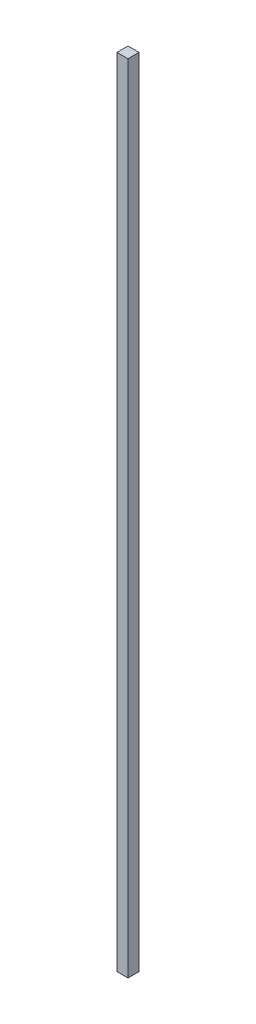
ISO-10303-21;
HEADER;
FILE_DESCRIPTION(('STEP AP214'),'2;1');
FILE_NAME('part.step','',(''),(''),'','','');
FILE_SCHEMA(('AUTOMOTIVE_DESIGN { 1 0 10303 214 1 1 1 1 }'));
ENDSEC;
DATA;
#1=APPLICATION_CONTEXT('core data for automotive mechanical design processes');
#2=APPLICATION_PROTOCOL_DEFINITION('international standard','automotive_design',2000,#1);
#3=PRODUCT_CONTEXT('',#1,'mechanical');
#4=PRODUCT('Part','Part','',(#3));
#5=PRODUCT_RELATED_PRODUCT_CATEGORY('part','',(#4));
#6=PRODUCT_DEFINITION_FORMATION('','',#4);
#7=PRODUCT_DEFINITION_CONTEXT('part definition',#1,'design');
#8=PRODUCT_DEFINITION('design','',#6,#7);
#9=PRODUCT_DEFINITION_SHAPE('','',#8);
#10=(LENGTH_UNIT() NAMED_UNIT(*) SI_UNIT(.MILLI.,.METRE.));
#11=(NAMED_UNIT(*) PLANE_ANGLE_UNIT() SI_UNIT($,.RADIAN.));
#12=(NAMED_UNIT(*) SI_UNIT($,.STERADIAN.) SOLID_ANGLE_UNIT());
#13=UNCERTAINTY_MEASURE_WITH_UNIT(LENGTH_MEASURE(1.E-05),#10,'distance_accuracy_value','');
#14=(GEOMETRIC_REPRESENTATION_CONTEXT(3) GLOBAL_UNCERTAINTY_ASSIGNED_CONTEXT((#13)) GLOBAL_UNIT_ASSIGNED_CONTEXT((#10,
#11,#12)) REPRESENTATION_CONTEXT('',''));
#15=CARTESIAN_POINT('',(0.,0.,0.));
#16=DIRECTION('',(0.,0.,1.));
#17=DIRECTION('',(1.,0.,0.));
#18=AXIS2_PLACEMENT_3D('',#15,#16,#17);
#19=CARTESIAN_POINT('',(0.,1828.8,0.));
#20=DIRECTION('',(-1.,0.,0.));
#21=DIRECTION('',(0.,0.,1.));
#22=AXIS2_PLACEMENT_3D('',#19,#20,#21);
#23=PLANE('',#22);
#24=DIRECTION('',(0.,0.,-1.));
#25=VECTOR('',#24,1.);
#26=CARTESIAN_POINT('',(0.,0.,0.));
#27=LINE('',#26,#25);
#28=CARTESIAN_POINT('',(0.,0.,25.4));
#29=VERTEX_POINT('',#28);
#30=CARTESIAN_POINT('',(0.,0.,0.));
#31=VERTEX_POINT('',#30);
#32=EDGE_CURVE('E96',#29,#31,#27,.T.);
#33=ORIENTED_EDGE('',*,*,#32,.T.);
#34=DIRECTION('',(0.,-1.,0.));
#35=VECTOR('',#34,1.);
#36=CARTESIAN_POINT('',(0.,1828.8,0.));
#37=LINE('',#36,#35);
#38=CARTESIAN_POINT('',(0.,1828.8,0.));
#39=VERTEX_POINT('',#38);
#40=EDGE_CURVE('E11',#39,#31,#37,.T.);
#41=ORIENTED_EDGE('',*,*,#40,.F.);
#42=DIRECTION('',(0.,0.,-1.));
#43=VECTOR('',#42,1.);
#44=CARTESIAN_POINT('',(0.,1828.8,0.));
#45=LINE('',#44,#43);
#46=CARTESIAN_POINT('',(0.,1828.8,25.4));
#47=VERTEX_POINT('',#46);
#48=EDGE_CURVE('E84',#47,#39,#45,.T.);
#49=ORIENTED_EDGE('',*,*,#48,.F.);
#50=DIRECTION('',(0.,-1.,0.));
#51=VECTOR('',#50,1.);
#52=CARTESIAN_POINT('',(0.,1828.8,25.4));
#53=LINE('',#52,#51);
#54=EDGE_CURVE('E92',#47,#29,#53,.T.);
#55=ORIENTED_EDGE('',*,*,#54,.T.);
#56=EDGE_LOOP('',(#33,#41,#49,#55));
#57=FACE_BOUND('',#56,.T.);
#58=ADVANCED_FACE('F33',(#57),#23,.F.);
#59=CARTESIAN_POINT('',(0.,1828.8,0.));
#60=DIRECTION('',(0.,0.,1.));
#61=DIRECTION('',(1.,0.,0.));
#62=AXIS2_PLACEMENT_3D('',#59,#60,#61);
#63=PLANE('',#62);
#64=DIRECTION('',(-1.,0.,0.));
#65=VECTOR('',#64,1.);
#66=CARTESIAN_POINT('',(0.,0.,0.));
#67=LINE('',#66,#65);
#68=CARTESIAN_POINT('',(-25.4,0.,0.));
#69=VERTEX_POINT('',#68);
#70=EDGE_CURVE('E88',#31,#69,#67,.T.);
#71=ORIENTED_EDGE('',*,*,#70,.T.);
#72=DIRECTION('',(0.,-1.,0.));
#73=VECTOR('',#72,1.);
#74=CARTESIAN_POINT('',(-25.4,1828.8,0.));
#75=LINE('',#74,#73);
#76=CARTESIAN_POINT('',(-25.4,1828.8,0.));
#77=VERTEX_POINT('',#76);
#78=EDGE_CURVE('E41',#77,#69,#75,.T.);
#79=ORIENTED_EDGE('',*,*,#78,.F.);
#80=DIRECTION('',(-1.,0.,0.));
#81=VECTOR('',#80,1.);
#82=CARTESIAN_POINT('',(0.,1828.8,0.));
#83=LINE('',#82,#81);
#84=EDGE_CURVE('E79',#39,#77,#83,.T.);
#85=ORIENTED_EDGE('',*,*,#84,.F.);
#86=ORIENTED_EDGE('',*,*,#40,.T.);
#87=EDGE_LOOP('',(#71,#79,#85,#86));
#88=FACE_BOUND('',#87,.T.);
#89=ADVANCED_FACE('F87',(#88),#63,.F.);
#90=CARTESIAN_POINT('',(-25.4,1828.8,0.));
#91=DIRECTION('',(1.,0.,0.));
#92=DIRECTION('',(0.,0.,-1.));
#93=AXIS2_PLACEMENT_3D('',#90,#91,#92);
#94=PLANE('',#93);
#95=DIRECTION('',(0.,0.,1.));
#96=VECTOR('',#95,1.);
#97=CARTESIAN_POINT('',(-25.4,0.,0.));
#98=LINE('',#97,#96);
#99=CARTESIAN_POINT('',(-25.4,0.,25.4));
#100=VERTEX_POINT('',#99);
#101=EDGE_CURVE('E66',#69,#100,#98,.T.);
#102=ORIENTED_EDGE('',*,*,#101,.T.);
#103=DIRECTION('',(0.,-1.,0.));
#104=VECTOR('',#103,1.);
#105=CARTESIAN_POINT('',(-25.4,1828.8,25.4));
#106=LINE('',#105,#104);
#107=CARTESIAN_POINT('',(-25.4,1828.8,25.4));
#108=VERTEX_POINT('',#107);
#109=EDGE_CURVE('E89',#108,#100,#106,.T.);
#110=ORIENTED_EDGE('',*,*,#109,.F.);
#111=DIRECTION('',(0.,0.,1.));
#112=VECTOR('',#111,1.);
#113=CARTESIAN_POINT('',(-25.4,1828.8,0.));
#114=LINE('',#113,#112);
#115=EDGE_CURVE('E82',#77,#108,#114,.T.);
#116=ORIENTED_EDGE('',*,*,#115,.F.);
#117=ORIENTED_EDGE('',*,*,#78,.T.);
#118=EDGE_LOOP('',(#102,#110,#116,#117));
#119=FACE_BOUND('',#118,.T.);
#120=ADVANCED_FACE('F90',(#119),#94,.F.);
#121=CARTESIAN_POINT('',(0.,1828.8,25.4));
#122=DIRECTION('',(0.,0.,-1.));
#123=DIRECTION('',(-1.,0.,0.));
#124=AXIS2_PLACEMENT_3D('',#121,#122,#123);
#125=PLANE('',#124);
#126=DIRECTION('',(1.,0.,0.));
#127=VECTOR('',#126,1.);
#128=CARTESIAN_POINT('',(0.,0.,25.4));
#129=LINE('',#128,#127);
#130=EDGE_CURVE('E72',#100,#29,#129,.T.);
#131=ORIENTED_EDGE('',*,*,#130,.T.);
#132=ORIENTED_EDGE('',*,*,#54,.F.);
#133=DIRECTION('',(1.,0.,0.));
#134=VECTOR('',#133,1.);
#135=CARTESIAN_POINT('',(0.,1828.8,25.4));
#136=LINE('',#135,#134);
#137=EDGE_CURVE('E49',#108,#47,#136,.T.);
#138=ORIENTED_EDGE('',*,*,#137,.F.);
#139=ORIENTED_EDGE('',*,*,#109,.T.);
#140=EDGE_LOOP('',(#131,#132,#138,#139));
#141=FACE_BOUND('',#140,.T.);
#142=ADVANCED_FACE('F103',(#141),#125,.F.);
#143=CARTESIAN_POINT('',(0.,1828.8,0.));
#144=DIRECTION('',(0.,-1.,0.));
#145=DIRECTION('',(0.,0.,-1.));
#146=AXIS2_PLACEMENT_3D('',#143,#144,#145);
#147=PLANE('',#146);
#148=ORIENTED_EDGE('',*,*,#48,.T.);
#149=ORIENTED_EDGE('',*,*,#84,.T.);
#150=ORIENTED_EDGE('',*,*,#115,.T.);
#151=ORIENTED_EDGE('',*,*,#137,.T.);
#152=EDGE_LOOP('',(#148,#149,#150,#151));
#153=FACE_BOUND('',#152,.T.);
#154=ADVANCED_FACE('F80',(#153),#147,.F.);
#155=CARTESIAN_POINT('',(0.,0.,0.));
#156=DIRECTION('',(0.,-1.,0.));
#157=DIRECTION('',(0.,0.,-1.));
#158=AXIS2_PLACEMENT_3D('',#155,#156,#157);
#159=PLANE('',#158);
#160=ORIENTED_EDGE('',*,*,#32,.F.);
#161=ORIENTED_EDGE('',*,*,#130,.F.);
#162=ORIENTED_EDGE('',*,*,#101,.F.);
#163=ORIENTED_EDGE('',*,*,#70,.F.);
#164=EDGE_LOOP('',(#160,#161,#162,#163));
#165=FACE_BOUND('',#164,.T.);
#166=ADVANCED_FACE('F106',(#165),#159,.T.);
#167=CLOSED_SHELL('',(#58,#89,#120,#142,#154,#166));
#168=MANIFOLD_SOLID_BREP('B2',#167);
#169=ADVANCED_BREP_SHAPE_REPRESENTATION('',(#18,#168),#14);
#170=SHAPE_DEFINITION_REPRESENTATION(#9,#169);
ENDSEC;
END-ISO-10303-21;
